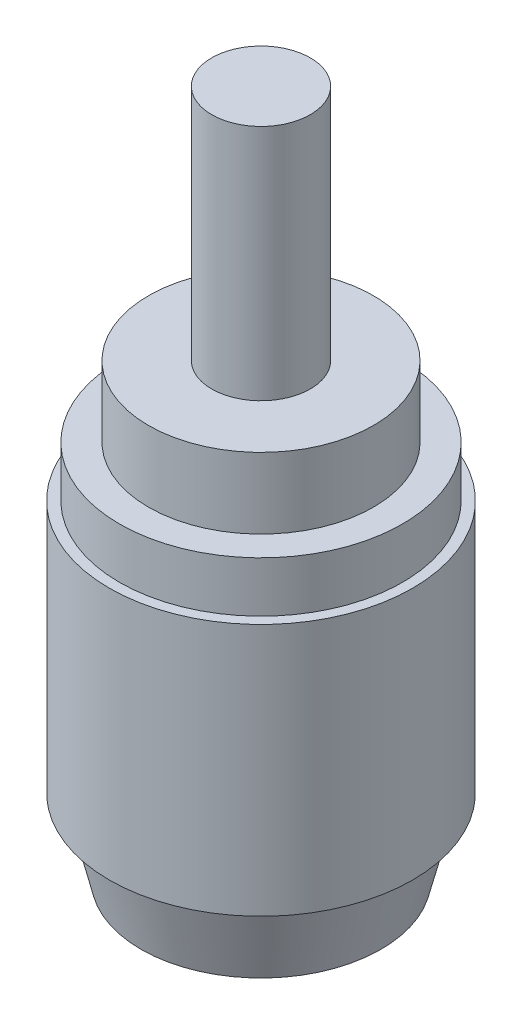
ISO-10303-21;
HEADER;
FILE_DESCRIPTION(('STEP AP214'),'2;1');
FILE_NAME('part.step','',(''),(''),'','','');
FILE_SCHEMA(('AUTOMOTIVE_DESIGN { 1 0 10303 214 1 1 1 1 }'));
ENDSEC;
DATA;
#1=APPLICATION_CONTEXT('core data for automotive mechanical design processes');
#2=APPLICATION_PROTOCOL_DEFINITION('international standard','automotive_design',2000,#1);
#3=PRODUCT_CONTEXT('',#1,'mechanical');
#4=PRODUCT('Part','Part','',(#3));
#5=PRODUCT_RELATED_PRODUCT_CATEGORY('part','',(#4));
#6=PRODUCT_DEFINITION_FORMATION('','',#4);
#7=PRODUCT_DEFINITION_CONTEXT('part definition',#1,'design');
#8=PRODUCT_DEFINITION('design','',#6,#7);
#9=PRODUCT_DEFINITION_SHAPE('','',#8);
#10=(LENGTH_UNIT() NAMED_UNIT(*) SI_UNIT(.MILLI.,.METRE.));
#11=(NAMED_UNIT(*) PLANE_ANGLE_UNIT() SI_UNIT($,.RADIAN.));
#12=(NAMED_UNIT(*) SI_UNIT($,.STERADIAN.) SOLID_ANGLE_UNIT());
#13=UNCERTAINTY_MEASURE_WITH_UNIT(LENGTH_MEASURE(1.E-05),#10,'distance_accuracy_value','');
#14=(GEOMETRIC_REPRESENTATION_CONTEXT(3) GLOBAL_UNCERTAINTY_ASSIGNED_CONTEXT((#13)) GLOBAL_UNIT_ASSIGNED_CONTEXT((#10,
#11,#12)) REPRESENTATION_CONTEXT('',''));
#15=CARTESIAN_POINT('',(0.,0.,0.));
#16=DIRECTION('',(0.,0.,1.));
#17=DIRECTION('',(1.,0.,0.));
#18=AXIS2_PLACEMENT_3D('',#15,#16,#17);
#19=CARTESIAN_POINT('',(0.,0.,0.));
#20=DIRECTION('',(0.,1.,0.));
#21=DIRECTION('',(0.,0.,1.));
#22=AXIS2_PLACEMENT_3D('',#19,#20,#21);
#23=PLANE('',#22);
#24=CARTESIAN_POINT('',(0.,0.,0.));
#25=DIRECTION('',(0.,1.,0.));
#26=DIRECTION('',(0.,0.,1.));
#27=AXIS2_PLACEMENT_3D('',#24,#25,#26);
#28=CIRCLE('',#27,4.75);
#29=CARTESIAN_POINT('',(0.,0.,4.75));
#30=VERTEX_POINT('',#29);
#31=EDGE_CURVE('E49',#30,#30,#28,.T.);
#32=ORIENTED_EDGE('',*,*,#31,.F.);
#33=EDGE_LOOP('',(#32));
#34=FACE_BOUND('',#33,.T.);
#35=ADVANCED_FACE('F46',(#34),#23,.F.);
#36=CARTESIAN_POINT('',(0.,0.,0.));
#37=DIRECTION('',(0.,1.,0.));
#38=DIRECTION('',(0.,0.,1.));
#39=AXIS2_PLACEMENT_3D('',#36,#37,#38);
#40=CONICAL_SURFACE('',#39,4.75,0.244978663126864);
#41=CARTESIAN_POINT('',(0.,3.,0.));
#42=DIRECTION('',(0.,1.,0.));
#43=DIRECTION('',(0.,0.,1.));
#44=AXIS2_PLACEMENT_3D('',#41,#42,#43);
#45=CIRCLE('',#44,5.5);
#46=CARTESIAN_POINT('',(0.,3.,5.5));
#47=VERTEX_POINT('',#46);
#48=EDGE_CURVE('E76',#47,#47,#45,.T.);
#49=ORIENTED_EDGE('',*,*,#48,.F.);
#50=EDGE_LOOP('',(#49));
#51=FACE_BOUND('',#50,.T.);
#52=ORIENTED_EDGE('',*,*,#31,.T.);
#53=EDGE_LOOP('',(#52));
#54=FACE_BOUND('',#53,.T.);
#55=ADVANCED_FACE('F83',(#51,#54),#40,.T.);
#56=CARTESIAN_POINT('',(5.5,3.,0.));
#57=DIRECTION('',(0.,1.,0.));
#58=DIRECTION('',(0.,0.,1.));
#59=AXIS2_PLACEMENT_3D('',#56,#57,#58);
#60=PLANE('',#59);
#61=CARTESIAN_POINT('',(0.,3.,0.));
#62=DIRECTION('',(0.,1.,0.));
#63=DIRECTION('',(0.,0.,1.));
#64=AXIS2_PLACEMENT_3D('',#61,#62,#63);
#65=CIRCLE('',#64,6.);
#66=CARTESIAN_POINT('',(0.,3.,6.));
#67=VERTEX_POINT('',#66);
#68=EDGE_CURVE('E74',#67,#67,#65,.T.);
#69=ORIENTED_EDGE('',*,*,#68,.F.);
#70=EDGE_LOOP('',(#69));
#71=FACE_BOUND('',#70,.T.);
#72=ORIENTED_EDGE('',*,*,#48,.T.);
#73=EDGE_LOOP('',(#72));
#74=FACE_BOUND('',#73,.T.);
#75=ADVANCED_FACE('F89',(#71,#74),#60,.F.);
#76=CARTESIAN_POINT('',(0.,15.7339985887864,0.));
#77=DIRECTION('',(0.,1.,0.));
#78=DIRECTION('',(0.,0.,1.));
#79=AXIS2_PLACEMENT_3D('',#76,#77,#78);
#80=CYLINDRICAL_SURFACE('',#79,6.);
#81=CARTESIAN_POINT('',(0.,13.,0.));
#82=DIRECTION('',(0.,1.,0.));
#83=DIRECTION('',(0.,0.,1.));
#84=AXIS2_PLACEMENT_3D('',#81,#82,#83);
#85=CIRCLE('',#84,6.);
#86=CARTESIAN_POINT('',(0.,13.,6.));
#87=VERTEX_POINT('',#86);
#88=EDGE_CURVE('E71',#87,#87,#85,.T.);
#89=ORIENTED_EDGE('',*,*,#88,.F.);
#90=EDGE_LOOP('',(#89));
#91=FACE_BOUND('',#90,.T.);
#92=ORIENTED_EDGE('',*,*,#68,.T.);
#93=EDGE_LOOP('',(#92));
#94=FACE_BOUND('',#93,.T.);
#95=ADVANCED_FACE('F94',(#91,#94),#80,.T.);
#96=CARTESIAN_POINT('',(6.,13.,0.));
#97=DIRECTION('',(0.,-1.,0.));
#98=DIRECTION('',(0.,0.,-1.));
#99=AXIS2_PLACEMENT_3D('',#96,#97,#98);
#100=PLANE('',#99);
#101=CARTESIAN_POINT('',(0.,13.,0.));
#102=DIRECTION('',(0.,1.,0.));
#103=DIRECTION('',(0.,0.,1.));
#104=AXIS2_PLACEMENT_3D('',#101,#102,#103);
#105=CIRCLE('',#104,5.6);
#106=CARTESIAN_POINT('',(0.,13.,5.6));
#107=VERTEX_POINT('',#106);
#108=EDGE_CURVE('E68',#107,#107,#105,.T.);
#109=ORIENTED_EDGE('',*,*,#108,.F.);
#110=EDGE_LOOP('',(#109));
#111=FACE_BOUND('',#110,.T.);
#112=ORIENTED_EDGE('',*,*,#88,.T.);
#113=EDGE_LOOP('',(#112));
#114=FACE_BOUND('',#113,.T.);
#115=ADVANCED_FACE('F100',(#111,#114),#100,.F.);
#116=CARTESIAN_POINT('',(0.,15.7339985887864,0.));
#117=DIRECTION('',(0.,1.,0.));
#118=DIRECTION('',(0.,0.,1.));
#119=AXIS2_PLACEMENT_3D('',#116,#117,#118);
#120=CYLINDRICAL_SURFACE('',#119,5.6);
#121=CARTESIAN_POINT('',(0.,15.,0.));
#122=DIRECTION('',(0.,1.,0.));
#123=DIRECTION('',(0.,0.,1.));
#124=AXIS2_PLACEMENT_3D('',#121,#122,#123);
#125=CIRCLE('',#124,5.6);
#126=CARTESIAN_POINT('',(0.,15.,5.6));
#127=VERTEX_POINT('',#126);
#128=EDGE_CURVE('E64',#127,#127,#125,.T.);
#129=ORIENTED_EDGE('',*,*,#128,.F.);
#130=EDGE_LOOP('',(#129));
#131=FACE_BOUND('',#130,.T.);
#132=ORIENTED_EDGE('',*,*,#108,.T.);
#133=EDGE_LOOP('',(#132));
#134=FACE_BOUND('',#133,.T.);
#135=ADVANCED_FACE('F104',(#131,#134),#120,.T.);
#136=CARTESIAN_POINT('',(5.6,15.,0.));
#137=DIRECTION('',(0.,-1.,0.));
#138=DIRECTION('',(0.,0.,-1.));
#139=AXIS2_PLACEMENT_3D('',#136,#137,#138);
#140=PLANE('',#139);
#141=CARTESIAN_POINT('',(0.,15.,0.));
#142=DIRECTION('',(0.,1.,0.));
#143=DIRECTION('',(0.,0.,1.));
#144=AXIS2_PLACEMENT_3D('',#141,#142,#143);
#145=CIRCLE('',#144,4.45);
#146=CARTESIAN_POINT('',(0.,15.,4.45));
#147=VERTEX_POINT('',#146);
#148=EDGE_CURVE('E53',#147,#147,#145,.T.);
#149=ORIENTED_EDGE('',*,*,#148,.F.);
#150=EDGE_LOOP('',(#149));
#151=FACE_BOUND('',#150,.T.);
#152=ORIENTED_EDGE('',*,*,#128,.T.);
#153=EDGE_LOOP('',(#152));
#154=FACE_BOUND('',#153,.T.);
#155=ADVANCED_FACE('F108',(#151,#154),#140,.F.);
#156=CARTESIAN_POINT('',(0.,17.8,0.));
#157=DIRECTION('',(0.,-1.,0.));
#158=DIRECTION('',(0.,0.,-1.));
#159=AXIS2_PLACEMENT_3D('',#156,#157,#158);
#160=CYLINDRICAL_SURFACE('',#159,4.45);
#161=CARTESIAN_POINT('',(0.,17.8,0.));
#162=DIRECTION('',(0.,1.,0.));
#163=DIRECTION('',(0.,0.,1.));
#164=AXIS2_PLACEMENT_3D('',#161,#162,#163);
#165=CIRCLE('',#164,4.45);
#166=CARTESIAN_POINT('',(0.,17.8,4.45));
#167=VERTEX_POINT('',#166);
#168=EDGE_CURVE('E62',#167,#167,#165,.T.);
#169=ORIENTED_EDGE('',*,*,#168,.F.);
#170=EDGE_LOOP('',(#169));
#171=FACE_BOUND('',#170,.T.);
#172=ORIENTED_EDGE('',*,*,#148,.T.);
#173=EDGE_LOOP('',(#172));
#174=FACE_BOUND('',#173,.T.);
#175=ADVANCED_FACE('F112',(#171,#174),#160,.T.);
#176=CARTESIAN_POINT('',(0.,17.8,0.));
#177=DIRECTION('',(0.,1.,0.));
#178=DIRECTION('',(0.,0.,1.));
#179=AXIS2_PLACEMENT_3D('',#176,#177,#178);
#180=PLANE('',#179);
#181=CARTESIAN_POINT('',(0.,17.8,0.));
#182=DIRECTION('',(0.,1.,0.));
#183=DIRECTION('',(0.,0.,1.));
#184=AXIS2_PLACEMENT_3D('',#181,#182,#183);
#185=CIRCLE('',#184,1.95);
#186=CARTESIAN_POINT('',(0.,17.8,1.95));
#187=VERTEX_POINT('',#186);
#188=EDGE_CURVE('E12',#187,#187,#185,.T.);
#189=ORIENTED_EDGE('',*,*,#188,.F.);
#190=EDGE_LOOP('',(#189));
#191=FACE_BOUND('',#190,.T.);
#192=ORIENTED_EDGE('',*,*,#168,.T.);
#193=EDGE_LOOP('',(#192));
#194=FACE_BOUND('',#193,.T.);
#195=ADVANCED_FACE('F116',(#191,#194),#180,.T.);
#196=CARTESIAN_POINT('',(0.,27.2,0.));
#197=DIRECTION('',(0.,-1.,0.));
#198=DIRECTION('',(0.,0.,-1.));
#199=AXIS2_PLACEMENT_3D('',#196,#197,#198);
#200=CYLINDRICAL_SURFACE('',#199,1.95);
#201=CARTESIAN_POINT('',(0.,27.2,0.));
#202=DIRECTION('',(0.,1.,0.));
#203=DIRECTION('',(0.,0.,1.));
#204=AXIS2_PLACEMENT_3D('',#201,#202,#203);
#205=CIRCLE('',#204,1.95);
#206=CARTESIAN_POINT('',(0.,27.2,1.95));
#207=VERTEX_POINT('',#206);
#208=EDGE_CURVE('E61',#207,#207,#205,.T.);
#209=ORIENTED_EDGE('',*,*,#208,.F.);
#210=EDGE_LOOP('',(#209));
#211=FACE_BOUND('',#210,.T.);
#212=ORIENTED_EDGE('',*,*,#188,.T.);
#213=EDGE_LOOP('',(#212));
#214=FACE_BOUND('',#213,.T.);
#215=ADVANCED_FACE('F120',(#211,#214),#200,.T.);
#216=CARTESIAN_POINT('',(0.,27.2,0.));
#217=DIRECTION('',(0.,1.,0.));
#218=DIRECTION('',(0.,0.,1.));
#219=AXIS2_PLACEMENT_3D('',#216,#217,#218);
#220=PLANE('',#219);
#221=ORIENTED_EDGE('',*,*,#208,.T.);
#222=EDGE_LOOP('',(#221));
#223=FACE_BOUND('',#222,.T.);
#224=ADVANCED_FACE('F124',(#223),#220,.T.);
#225=CLOSED_SHELL('',(#35,#55,#75,#95,#115,#135,#155,#175,#195,#215,#224));
#226=MANIFOLD_SOLID_BREP('B2',#225);
#227=ADVANCED_BREP_SHAPE_REPRESENTATION('',(#18,#226),#14);
#228=SHAPE_DEFINITION_REPRESENTATION(#9,#227);
ENDSEC;
END-ISO-10303-21;
